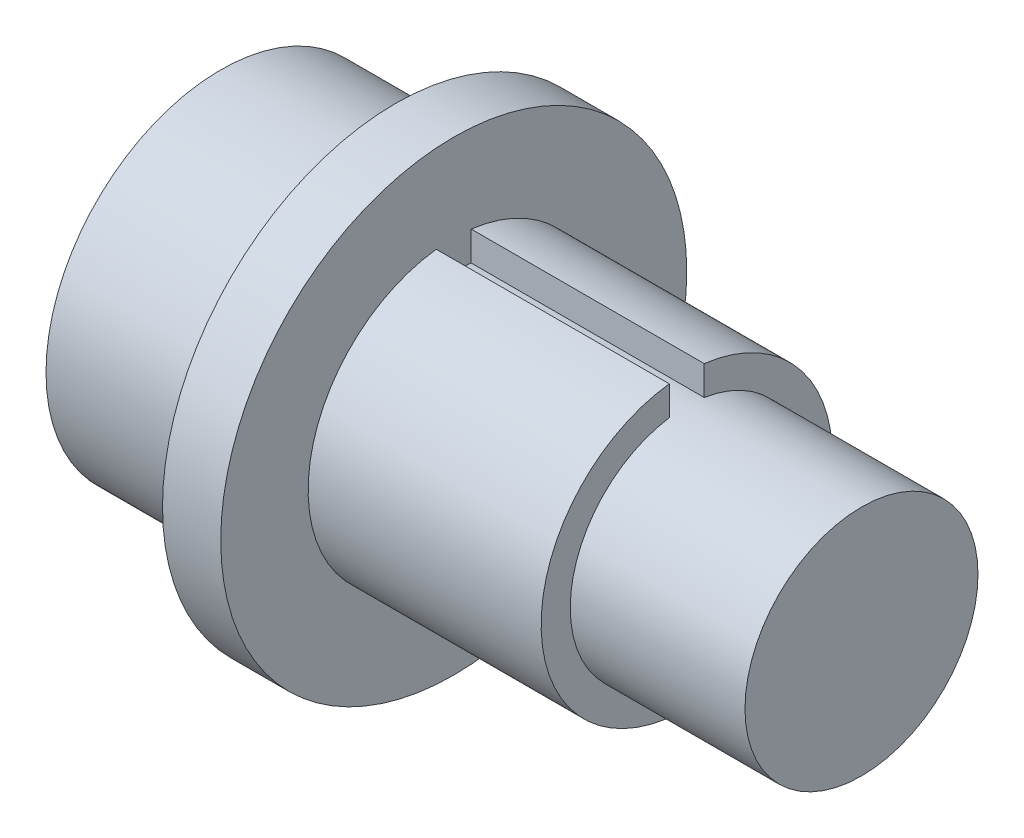
ISO-10303-21;
HEADER;
FILE_DESCRIPTION(('STEP AP214'),'2;1');
FILE_NAME('part.step','',(''),(''),'','','');
FILE_SCHEMA(('AUTOMOTIVE_DESIGN { 1 0 10303 214 1 1 1 1 }'));
ENDSEC;
DATA;
#1=APPLICATION_CONTEXT('core data for automotive mechanical design processes');
#2=APPLICATION_PROTOCOL_DEFINITION('international standard','automotive_design',2000,#1);
#3=PRODUCT_CONTEXT('',#1,'mechanical');
#4=PRODUCT('Part','Part','',(#3));
#5=PRODUCT_RELATED_PRODUCT_CATEGORY('part','',(#4));
#6=PRODUCT_DEFINITION_FORMATION('','',#4);
#7=PRODUCT_DEFINITION_CONTEXT('part definition',#1,'design');
#8=PRODUCT_DEFINITION('design','',#6,#7);
#9=PRODUCT_DEFINITION_SHAPE('','',#8);
#10=(LENGTH_UNIT() NAMED_UNIT(*) SI_UNIT(.MILLI.,.METRE.));
#11=(NAMED_UNIT(*) PLANE_ANGLE_UNIT() SI_UNIT($,.RADIAN.));
#12=(NAMED_UNIT(*) SI_UNIT($,.STERADIAN.) SOLID_ANGLE_UNIT());
#13=UNCERTAINTY_MEASURE_WITH_UNIT(LENGTH_MEASURE(1.E-05),#10,'distance_accuracy_value','');
#14=(GEOMETRIC_REPRESENTATION_CONTEXT(3) GLOBAL_UNCERTAINTY_ASSIGNED_CONTEXT((#13)) GLOBAL_UNIT_ASSIGNED_CONTEXT((#10,
#11,#12)) REPRESENTATION_CONTEXT('',''));
#15=CARTESIAN_POINT('',(0.,0.,0.));
#16=DIRECTION('',(0.,0.,1.));
#17=DIRECTION('',(1.,0.,0.));
#18=AXIS2_PLACEMENT_3D('',#15,#16,#17);
#19=CARTESIAN_POINT('',(0.,0.,0.));
#20=DIRECTION('',(1.,0.,0.));
#21=DIRECTION('',(0.,0.,-1.));
#22=AXIS2_PLACEMENT_3D('',#19,#20,#21);
#23=PLANE('',#22);
#24=CARTESIAN_POINT('',(0.,0.,0.));
#25=DIRECTION('',(-1.,0.,0.));
#26=DIRECTION('',(0.,0.,1.));
#27=AXIS2_PLACEMENT_3D('',#24,#25,#26);
#28=CIRCLE('',#27,30.);
#29=CARTESIAN_POINT('',(0.,0.,30.));
#30=VERTEX_POINT('',#29);
#31=EDGE_CURVE('E11',#30,#30,#28,.T.);
#32=ORIENTED_EDGE('',*,*,#31,.T.);
#33=EDGE_LOOP('',(#32));
#34=FACE_BOUND('',#33,.T.);
#35=ADVANCED_FACE('F33',(#34),#23,.F.);
#36=CARTESIAN_POINT('',(-14.6847674407859,0.,0.));
#37=DIRECTION('',(-1.,0.,0.));
#38=DIRECTION('',(0.,0.,1.));
#39=AXIS2_PLACEMENT_3D('',#36,#37,#38);
#40=CYLINDRICAL_SURFACE('',#39,30.);
#41=ORIENTED_EDGE('',*,*,#31,.F.);
#42=EDGE_LOOP('',(#41));
#43=FACE_BOUND('',#42,.T.);
#44=CARTESIAN_POINT('',(30.,0.,0.));
#45=DIRECTION('',(-1.,0.,0.));
#46=DIRECTION('',(0.,0.,1.));
#47=AXIS2_PLACEMENT_3D('',#44,#45,#46);
#48=CIRCLE('',#47,30.);
#49=CARTESIAN_POINT('',(30.,0.,30.));
#50=VERTEX_POINT('',#49);
#51=EDGE_CURVE('E40',#50,#50,#48,.T.);
#52=ORIENTED_EDGE('',*,*,#51,.T.);
#53=EDGE_LOOP('',(#52));
#54=FACE_BOUND('',#53,.T.);
#55=ADVANCED_FACE('F119',(#43,#54),#40,.T.);
#56=CARTESIAN_POINT('',(30.,30.,0.));
#57=DIRECTION('',(1.,0.,0.));
#58=DIRECTION('',(0.,0.,-1.));
#59=AXIS2_PLACEMENT_3D('',#56,#57,#58);
#60=PLANE('',#59);
#61=ORIENTED_EDGE('',*,*,#51,.F.);
#62=EDGE_LOOP('',(#61));
#63=FACE_BOUND('',#62,.T.);
#64=CARTESIAN_POINT('',(30.,0.,0.));
#65=DIRECTION('',(-1.,0.,0.));
#66=DIRECTION('',(0.,0.,1.));
#67=AXIS2_PLACEMENT_3D('',#64,#65,#66);
#68=CIRCLE('',#67,40.);
#69=CARTESIAN_POINT('',(30.,0.,40.));
#70=VERTEX_POINT('',#69);
#71=EDGE_CURVE('E114',#70,#70,#68,.T.);
#72=ORIENTED_EDGE('',*,*,#71,.T.);
#73=EDGE_LOOP('',(#72));
#74=FACE_BOUND('',#73,.T.);
#75=ADVANCED_FACE('F121',(#63,#74),#60,.F.);
#76=CARTESIAN_POINT('',(-14.6847674407859,0.,0.));
#77=DIRECTION('',(-1.,0.,0.));
#78=DIRECTION('',(0.,0.,1.));
#79=AXIS2_PLACEMENT_3D('',#76,#77,#78);
#80=CYLINDRICAL_SURFACE('',#79,40.);
#81=ORIENTED_EDGE('',*,*,#71,.F.);
#82=EDGE_LOOP('',(#81));
#83=FACE_BOUND('',#82,.T.);
#84=CARTESIAN_POINT('',(40.,0.,0.));
#85=DIRECTION('',(-1.,0.,0.));
#86=DIRECTION('',(0.,0.,1.));
#87=AXIS2_PLACEMENT_3D('',#84,#85,#86);
#88=CIRCLE('',#87,40.);
#89=CARTESIAN_POINT('',(40.,0.,40.));
#90=VERTEX_POINT('',#89);
#91=EDGE_CURVE('E111',#90,#90,#88,.T.);
#92=ORIENTED_EDGE('',*,*,#91,.T.);
#93=EDGE_LOOP('',(#92));
#94=FACE_BOUND('',#93,.T.);
#95=ADVANCED_FACE('F124',(#83,#94),#80,.T.);
#96=CARTESIAN_POINT('',(40.,40.,0.));
#97=DIRECTION('',(-1.,0.,0.));
#98=DIRECTION('',(0.,0.,1.));
#99=AXIS2_PLACEMENT_3D('',#96,#97,#98);
#100=PLANE('',#99);
#101=ORIENTED_EDGE('',*,*,#91,.F.);
#102=EDGE_LOOP('',(#101));
#103=FACE_BOUND('',#102,.T.);
#104=CARTESIAN_POINT('',(40.,0.,0.));
#105=DIRECTION('',(-1.,0.,0.));
#106=DIRECTION('',(0.,0.,1.));
#107=AXIS2_PLACEMENT_3D('',#104,#105,#106);
#108=CIRCLE('',#107,25.);
#109=CARTESIAN_POINT('',(40.,24.8193472919817,-3.));
#110=VERTEX_POINT('',#109);
#111=CARTESIAN_POINT('',(40.,24.8193472919817,3.));
#112=VERTEX_POINT('',#111);
#113=EDGE_CURVE('E89',#110,#112,#108,.T.);
#114=ORIENTED_EDGE('',*,*,#113,.T.);
#115=DIRECTION('',(0.,-1.,0.));
#116=VECTOR('',#115,1.);
#117=CARTESIAN_POINT('',(40.,24.8193472919817,3.));
#118=LINE('',#117,#116);
#119=CARTESIAN_POINT('',(40.,19.7737199332852,3.));
#120=VERTEX_POINT('',#119);
#121=EDGE_CURVE('E67',#112,#120,#118,.T.);
#122=ORIENTED_EDGE('',*,*,#121,.T.);
#123=CARTESIAN_POINT('',(40.,0.,0.));
#124=DIRECTION('',(-1.,0.,0.));
#125=DIRECTION('',(0.,0.,1.));
#126=AXIS2_PLACEMENT_3D('',#123,#124,#125);
#127=CIRCLE('',#126,20.);
#128=CARTESIAN_POINT('',(40.,19.7737199332852,-3.));
#129=VERTEX_POINT('',#128);
#130=EDGE_CURVE('E74',#120,#129,#127,.T.);
#131=ORIENTED_EDGE('',*,*,#130,.T.);
#132=DIRECTION('',(0.,1.,0.));
#133=VECTOR('',#132,1.);
#134=CARTESIAN_POINT('',(40.,19.7737199332852,-3.));
#135=LINE('',#134,#133);
#136=EDGE_CURVE('E95',#129,#110,#135,.T.);
#137=ORIENTED_EDGE('',*,*,#136,.T.);
#138=EDGE_LOOP('',(#114,#122,#131,#137));
#139=FACE_BOUND('',#138,.T.);
#140=ADVANCED_FACE('F87',(#103,#139),#100,.F.);
#141=CARTESIAN_POINT('',(-14.6847674407859,0.,0.));
#142=DIRECTION('',(-1.,0.,0.));
#143=DIRECTION('',(0.,0.,1.));
#144=AXIS2_PLACEMENT_3D('',#141,#142,#143);
#145=CYLINDRICAL_SURFACE('',#144,25.);
#146=CARTESIAN_POINT('',(80.,0.,0.));
#147=DIRECTION('',(-1.,0.,0.));
#148=DIRECTION('',(0.,0.,1.));
#149=AXIS2_PLACEMENT_3D('',#146,#147,#148);
#150=CIRCLE('',#149,25.);
#151=CARTESIAN_POINT('',(80.,24.8193472919817,-3.));
#152=VERTEX_POINT('',#151);
#153=CARTESIAN_POINT('',(80.,24.8193472919817,3.));
#154=VERTEX_POINT('',#153);
#155=EDGE_CURVE('E107',#152,#154,#150,.T.);
#156=ORIENTED_EDGE('',*,*,#155,.T.);
#157=DIRECTION('',(1.,0.,0.));
#158=VECTOR('',#157,1.);
#159=CARTESIAN_POINT('',(32.0429903018948,24.8193472919817,3.));
#160=LINE('',#159,#158);
#161=EDGE_CURVE('E53',#112,#154,#160,.T.);
#162=ORIENTED_EDGE('',*,*,#161,.F.);
#163=ORIENTED_EDGE('',*,*,#113,.F.);
#164=DIRECTION('',(1.,0.,0.));
#165=VECTOR('',#164,1.);
#166=CARTESIAN_POINT('',(32.0429903018948,24.8193472919817,-3.));
#167=LINE('',#166,#165);
#168=EDGE_CURVE('E96',#110,#152,#167,.T.);
#169=ORIENTED_EDGE('',*,*,#168,.T.);
#170=EDGE_LOOP('',(#156,#162,#163,#169));
#171=FACE_BOUND('',#170,.T.);
#172=ADVANCED_FACE('F134',(#171),#145,.T.);
#173=CARTESIAN_POINT('',(80.,25.,0.));
#174=DIRECTION('',(-1.,0.,0.));
#175=DIRECTION('',(0.,0.,1.));
#176=AXIS2_PLACEMENT_3D('',#173,#174,#175);
#177=PLANE('',#176);
#178=CARTESIAN_POINT('',(80.,0.,0.));
#179=DIRECTION('',(-1.,0.,0.));
#180=DIRECTION('',(0.,0.,1.));
#181=AXIS2_PLACEMENT_3D('',#178,#179,#180);
#182=CIRCLE('',#181,20.);
#183=CARTESIAN_POINT('',(80.,19.7737199332852,-3.));
#184=VERTEX_POINT('',#183);
#185=CARTESIAN_POINT('',(80.,19.7737199332852,3.));
#186=VERTEX_POINT('',#185);
#187=EDGE_CURVE('E105',#184,#186,#182,.T.);
#188=ORIENTED_EDGE('',*,*,#187,.T.);
#189=DIRECTION('',(0.,-1.,0.));
#190=VECTOR('',#189,1.);
#191=CARTESIAN_POINT('',(80.,24.8193472919817,3.));
#192=LINE('',#191,#190);
#193=EDGE_CURVE('E47',#154,#186,#192,.T.);
#194=ORIENTED_EDGE('',*,*,#193,.F.);
#195=ORIENTED_EDGE('',*,*,#155,.F.);
#196=DIRECTION('',(0.,1.,0.));
#197=VECTOR('',#196,1.);
#198=CARTESIAN_POINT('',(80.,19.7737199332852,-3.));
#199=LINE('',#198,#197);
#200=EDGE_CURVE('E90',#184,#152,#199,.T.);
#201=ORIENTED_EDGE('',*,*,#200,.F.);
#202=EDGE_LOOP('',(#188,#194,#195,#201));
#203=FACE_BOUND('',#202,.T.);
#204=ADVANCED_FACE('F139',(#203),#177,.F.);
#205=CARTESIAN_POINT('',(-14.6847674407859,0.,0.));
#206=DIRECTION('',(-1.,0.,0.));
#207=DIRECTION('',(0.,0.,1.));
#208=AXIS2_PLACEMENT_3D('',#205,#206,#207);
#209=CYLINDRICAL_SURFACE('',#208,20.);
#210=ORIENTED_EDGE('',*,*,#187,.F.);
#211=DIRECTION('',(1.,0.,0.));
#212=VECTOR('',#211,1.);
#213=CARTESIAN_POINT('',(32.0429903018948,19.7737199332852,-3.));
#214=LINE('',#213,#212);
#215=EDGE_CURVE('E80',#129,#184,#214,.T.);
#216=ORIENTED_EDGE('',*,*,#215,.F.);
#217=ORIENTED_EDGE('',*,*,#130,.F.);
#218=DIRECTION('',(1.,0.,0.));
#219=VECTOR('',#218,1.);
#220=CARTESIAN_POINT('',(32.0429903018948,19.7737199332852,3.));
#221=LINE('',#220,#219);
#222=EDGE_CURVE('E78',#120,#186,#221,.T.);
#223=ORIENTED_EDGE('',*,*,#222,.T.);
#224=EDGE_LOOP('',(#210,#216,#217,#223));
#225=FACE_BOUND('',#224,.T.);
#226=CARTESIAN_POINT('',(110.,0.,0.));
#227=DIRECTION('',(-1.,0.,0.));
#228=DIRECTION('',(0.,0.,1.));
#229=AXIS2_PLACEMENT_3D('',#226,#227,#228);
#230=CIRCLE('',#229,20.);
#231=CARTESIAN_POINT('',(110.,0.,20.));
#232=VERTEX_POINT('',#231);
#233=EDGE_CURVE('E102',#232,#232,#230,.T.);
#234=ORIENTED_EDGE('',*,*,#233,.T.);
#235=EDGE_LOOP('',(#234));
#236=FACE_BOUND('',#235,.T.);
#237=ADVANCED_FACE('F76',(#225,#236),#209,.T.);
#238=CARTESIAN_POINT('',(110.,20.,0.));
#239=DIRECTION('',(-1.,0.,0.));
#240=DIRECTION('',(0.,0.,1.));
#241=AXIS2_PLACEMENT_3D('',#238,#239,#240);
#242=PLANE('',#241);
#243=ORIENTED_EDGE('',*,*,#233,.F.);
#244=EDGE_LOOP('',(#243));
#245=FACE_BOUND('',#244,.T.);
#246=ADVANCED_FACE('F165',(#245),#242,.F.);
#247=CARTESIAN_POINT('',(32.0429903018948,24.8193472919817,3.));
#248=DIRECTION('',(0.,0.,1.));
#249=DIRECTION('',(0.,-1.,0.));
#250=AXIS2_PLACEMENT_3D('',#247,#248,#249);
#251=PLANE('',#250);
#252=ORIENTED_EDGE('',*,*,#161,.T.);
#253=ORIENTED_EDGE('',*,*,#193,.T.);
#254=ORIENTED_EDGE('',*,*,#222,.F.);
#255=ORIENTED_EDGE('',*,*,#121,.F.);
#256=EDGE_LOOP('',(#252,#253,#254,#255));
#257=FACE_BOUND('',#256,.T.);
#258=ADVANCED_FACE('F84',(#257),#251,.F.);
#259=CARTESIAN_POINT('',(32.0429903018948,19.7737199332852,-3.));
#260=DIRECTION('',(0.,0.,-1.));
#261=DIRECTION('',(-1.,0.,0.));
#262=AXIS2_PLACEMENT_3D('',#259,#260,#261);
#263=PLANE('',#262);
#264=ORIENTED_EDGE('',*,*,#215,.T.);
#265=ORIENTED_EDGE('',*,*,#200,.T.);
#266=ORIENTED_EDGE('',*,*,#168,.F.);
#267=ORIENTED_EDGE('',*,*,#136,.F.);
#268=EDGE_LOOP('',(#264,#265,#266,#267));
#269=FACE_BOUND('',#268,.T.);
#270=ADVANCED_FACE('F207',(#269),#263,.F.);
#271=CLOSED_SHELL('',(#35,#55,#75,#95,#140,#172,#204,#237,#246,#258,#270));
#272=MANIFOLD_SOLID_BREP('B2',#271);
#273=ADVANCED_BREP_SHAPE_REPRESENTATION('',(#18,#272),#14);
#274=SHAPE_DEFINITION_REPRESENTATION(#9,#273);
ENDSEC;
END-ISO-10303-21;
